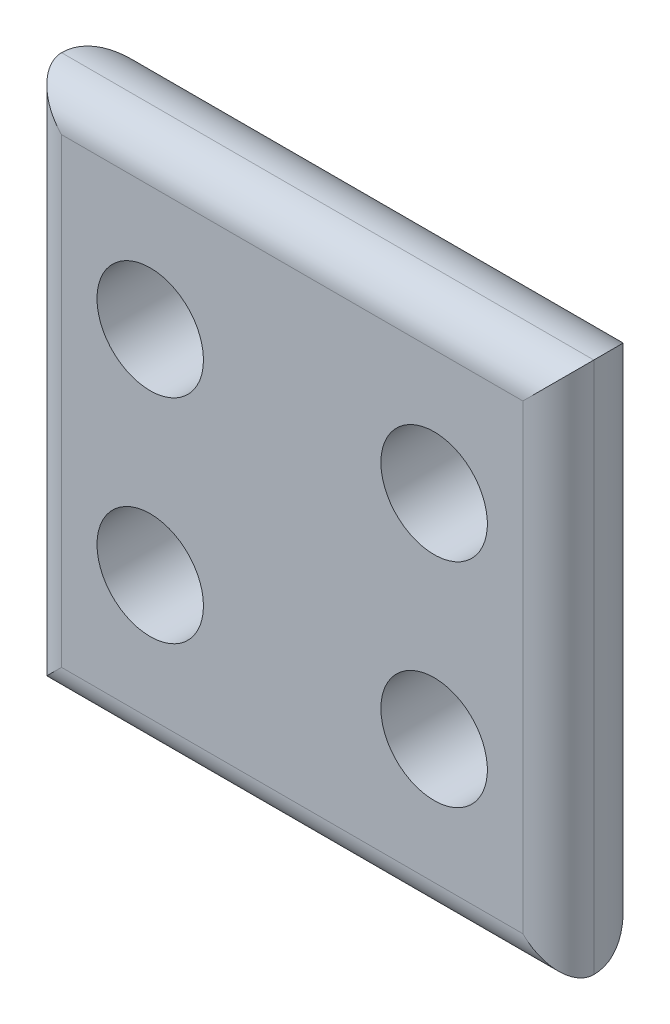
ISO-10303-21;
HEADER;
FILE_DESCRIPTION(('STEP AP214'),'2;1');
FILE_NAME('part.step','',(''),(''),'','','');
FILE_SCHEMA(('AUTOMOTIVE_DESIGN { 1 0 10303 214 1 1 1 1 }'));
ENDSEC;
DATA;
#1=APPLICATION_CONTEXT('core data for automotive mechanical design processes');
#2=APPLICATION_PROTOCOL_DEFINITION('international standard','automotive_design',2000,#1);
#3=PRODUCT_CONTEXT('',#1,'mechanical');
#4=PRODUCT('Part','Part','',(#3));
#5=PRODUCT_RELATED_PRODUCT_CATEGORY('part','',(#4));
#6=PRODUCT_DEFINITION_FORMATION('','',#4);
#7=PRODUCT_DEFINITION_CONTEXT('part definition',#1,'design');
#8=PRODUCT_DEFINITION('design','',#6,#7);
#9=PRODUCT_DEFINITION_SHAPE('','',#8);
#10=(LENGTH_UNIT() NAMED_UNIT(*) SI_UNIT(.MILLI.,.METRE.));
#11=(NAMED_UNIT(*) PLANE_ANGLE_UNIT() SI_UNIT($,.RADIAN.));
#12=(NAMED_UNIT(*) SI_UNIT($,.STERADIAN.) SOLID_ANGLE_UNIT());
#13=UNCERTAINTY_MEASURE_WITH_UNIT(LENGTH_MEASURE(1.E-05),#10,'distance_accuracy_value','');
#14=(GEOMETRIC_REPRESENTATION_CONTEXT(3) GLOBAL_UNCERTAINTY_ASSIGNED_CONTEXT((#13)) GLOBAL_UNIT_ASSIGNED_CONTEXT((#10,
#11,#12)) REPRESENTATION_CONTEXT('',''));
#15=CARTESIAN_POINT('',(0.,0.,0.));
#16=DIRECTION('',(0.,0.,1.));
#17=DIRECTION('',(1.,0.,0.));
#18=AXIS2_PLACEMENT_3D('',#15,#16,#17);
#19=CARTESIAN_POINT('',(0.,0.,3.));
#20=DIRECTION('',(0.,0.,1.));
#21=DIRECTION('',(1.,0.,0.));
#22=AXIS2_PLACEMENT_3D('',#19,#20,#21);
#23=PLANE('',#22);
#24=DIRECTION('',(1.,0.,0.));
#25=VECTOR('',#24,1.);
#26=CARTESIAN_POINT('',(7.5,-6.5,3.));
#27=LINE('',#26,#25);
#28=CARTESIAN_POINT('',(-6.5,-6.5,3.));
#29=VERTEX_POINT('',#28);
#30=CARTESIAN_POINT('',(6.5,-6.5,3.));
#31=VERTEX_POINT('',#30);
#32=EDGE_CURVE('E131',#29,#31,#27,.T.);
#33=ORIENTED_EDGE('',*,*,#32,.T.);
#34=DIRECTION('',(0.,1.,0.));
#35=VECTOR('',#34,1.);
#36=CARTESIAN_POINT('',(6.5,7.5,3.));
#37=LINE('',#36,#35);
#38=CARTESIAN_POINT('',(6.5,6.5,3.));
#39=VERTEX_POINT('',#38);
#40=EDGE_CURVE('E112',#31,#39,#37,.T.);
#41=ORIENTED_EDGE('',*,*,#40,.T.);
#42=DIRECTION('',(-1.,0.,0.));
#43=VECTOR('',#42,1.);
#44=CARTESIAN_POINT('',(-7.5,6.5,3.));
#45=LINE('',#44,#43);
#46=CARTESIAN_POINT('',(-6.5,6.5,3.));
#47=VERTEX_POINT('',#46);
#48=EDGE_CURVE('E121',#39,#47,#45,.T.);
#49=ORIENTED_EDGE('',*,*,#48,.T.);
#50=DIRECTION('',(0.,-1.,0.));
#51=VECTOR('',#50,1.);
#52=CARTESIAN_POINT('',(-6.5,-7.5,3.));
#53=LINE('',#52,#51);
#54=EDGE_CURVE('E126',#47,#29,#53,.T.);
#55=ORIENTED_EDGE('',*,*,#54,.T.);
#56=EDGE_LOOP('',(#33,#41,#49,#55));
#57=FACE_BOUND('',#56,.T.);
#58=CARTESIAN_POINT('',(-4.,-3.,3.));
#59=DIRECTION('',(0.,0.,1.));
#60=DIRECTION('',(1.,0.,0.));
#61=AXIS2_PLACEMENT_3D('',#58,#59,#60);
#62=CIRCLE('',#61,1.5);
#63=CARTESIAN_POINT('',(-2.50000000000001,-3.,3.));
#64=VERTEX_POINT('',#63);
#65=EDGE_CURVE('E251',#64,#64,#62,.T.);
#66=ORIENTED_EDGE('',*,*,#65,.F.);
#67=EDGE_LOOP('',(#66));
#68=FACE_BOUND('',#67,.T.);
#69=CARTESIAN_POINT('',(-4.,3.,3.));
#70=DIRECTION('',(0.,0.,1.));
#71=DIRECTION('',(1.,0.,0.));
#72=AXIS2_PLACEMENT_3D('',#69,#70,#71);
#73=CIRCLE('',#72,1.5);
#74=CARTESIAN_POINT('',(-2.50000000000001,3.,3.));
#75=VERTEX_POINT('',#74);
#76=EDGE_CURVE('E127',#75,#75,#73,.T.);
#77=ORIENTED_EDGE('',*,*,#76,.F.);
#78=EDGE_LOOP('',(#77));
#79=FACE_BOUND('',#78,.T.);
#80=CARTESIAN_POINT('',(4.,-3.,3.));
#81=DIRECTION('',(0.,0.,1.));
#82=DIRECTION('',(-1.,0.,0.));
#83=AXIS2_PLACEMENT_3D('',#80,#81,#82);
#84=CIRCLE('',#83,1.5);
#85=CARTESIAN_POINT('',(2.50000000000001,-3.,3.));
#86=VERTEX_POINT('',#85);
#87=EDGE_CURVE('E186',#86,#86,#84,.T.);
#88=ORIENTED_EDGE('',*,*,#87,.F.);
#89=EDGE_LOOP('',(#88));
#90=FACE_BOUND('',#89,.T.);
#91=CARTESIAN_POINT('',(4.,3.,3.));
#92=DIRECTION('',(0.,0.,1.));
#93=DIRECTION('',(-1.,0.,0.));
#94=AXIS2_PLACEMENT_3D('',#91,#92,#93);
#95=CIRCLE('',#94,1.5);
#96=CARTESIAN_POINT('',(2.50000000000001,3.,3.));
#97=VERTEX_POINT('',#96);
#98=EDGE_CURVE('E254',#97,#97,#95,.T.);
#99=ORIENTED_EDGE('',*,*,#98,.F.);
#100=EDGE_LOOP('',(#99));
#101=FACE_BOUND('',#100,.T.);
#102=ADVANCED_FACE('F39',(#57,#68,#79,#90,#101),#23,.T.);
#103=CARTESIAN_POINT('',(0.,0.,0.));
#104=DIRECTION('',(0.,0.,1.));
#105=DIRECTION('',(1.,0.,0.));
#106=AXIS2_PLACEMENT_3D('',#103,#104,#105);
#107=PLANE('',#106);
#108=CARTESIAN_POINT('',(4.,3.,0.));
#109=DIRECTION('',(0.,0.,1.));
#110=DIRECTION('',(-1.,0.,0.));
#111=AXIS2_PLACEMENT_3D('',#108,#109,#110);
#112=CIRCLE('',#111,1.5);
#113=CARTESIAN_POINT('',(5.5,3.,0.));
#114=VERTEX_POINT('',#113);
#115=EDGE_CURVE('E151',#114,#114,#112,.T.);
#116=ORIENTED_EDGE('',*,*,#115,.T.);
#117=DIRECTION('',(0.,1.,0.));
#118=VECTOR('',#117,1.);
#119=CARTESIAN_POINT('',(5.5,0.,0.));
#120=LINE('',#119,#118);
#121=CARTESIAN_POINT('',(5.5,-3.,0.));
#122=VERTEX_POINT('',#121);
#123=EDGE_CURVE('E11',#114,#122,#120,.F.);
#124=ORIENTED_EDGE('',*,*,#123,.T.);
#125=CARTESIAN_POINT('',(4.,-3.,0.));
#126=DIRECTION('',(0.,0.,1.));
#127=DIRECTION('',(-1.,0.,0.));
#128=AXIS2_PLACEMENT_3D('',#125,#126,#127);
#129=CIRCLE('',#128,1.5);
#130=EDGE_CURVE('E191',#122,#122,#129,.T.);
#131=ORIENTED_EDGE('',*,*,#130,.T.);
#132=DIRECTION('',(0.,1.,0.));
#133=VECTOR('',#132,1.);
#134=CARTESIAN_POINT('',(5.5,0.,0.));
#135=LINE('',#134,#133);
#136=CARTESIAN_POINT('',(5.5,-5.5,0.));
#137=VERTEX_POINT('',#136);
#138=EDGE_CURVE('E48',#122,#137,#135,.F.);
#139=ORIENTED_EDGE('',*,*,#138,.T.);
#140=DIRECTION('',(1.,0.,0.));
#141=VECTOR('',#140,1.);
#142=CARTESIAN_POINT('',(0.,-5.5,0.));
#143=LINE('',#142,#141);
#144=CARTESIAN_POINT('',(-5.5,-5.5,0.));
#145=VERTEX_POINT('',#144);
#146=EDGE_CURVE('E161',#137,#145,#143,.F.);
#147=ORIENTED_EDGE('',*,*,#146,.T.);
#148=DIRECTION('',(0.,-1.,0.));
#149=VECTOR('',#148,1.);
#150=CARTESIAN_POINT('',(-5.5,0.,0.));
#151=LINE('',#150,#149);
#152=CARTESIAN_POINT('',(-5.5,-3.,0.));
#153=VERTEX_POINT('',#152);
#154=EDGE_CURVE('E159',#145,#153,#151,.F.);
#155=ORIENTED_EDGE('',*,*,#154,.T.);
#156=CARTESIAN_POINT('',(-4.,-3.,0.));
#157=DIRECTION('',(0.,0.,1.));
#158=DIRECTION('',(1.,0.,0.));
#159=AXIS2_PLACEMENT_3D('',#156,#157,#158);
#160=CIRCLE('',#159,1.5);
#161=EDGE_CURVE('E256',#153,#153,#160,.T.);
#162=ORIENTED_EDGE('',*,*,#161,.T.);
#163=DIRECTION('',(0.,-1.,0.));
#164=VECTOR('',#163,1.);
#165=CARTESIAN_POINT('',(-5.5,0.,0.));
#166=LINE('',#165,#164);
#167=CARTESIAN_POINT('',(-5.5,3.,0.));
#168=VERTEX_POINT('',#167);
#169=EDGE_CURVE('E157',#153,#168,#166,.F.);
#170=ORIENTED_EDGE('',*,*,#169,.T.);
#171=CARTESIAN_POINT('',(-4.,3.,0.));
#172=DIRECTION('',(0.,0.,1.));
#173=DIRECTION('',(1.,0.,0.));
#174=AXIS2_PLACEMENT_3D('',#171,#172,#173);
#175=CIRCLE('',#174,1.5);
#176=EDGE_CURVE('E183',#168,#168,#175,.T.);
#177=ORIENTED_EDGE('',*,*,#176,.T.);
#178=DIRECTION('',(0.,-1.,0.));
#179=VECTOR('',#178,1.);
#180=CARTESIAN_POINT('',(-5.5,0.,0.));
#181=LINE('',#180,#179);
#182=CARTESIAN_POINT('',(-5.5,5.5,0.));
#183=VERTEX_POINT('',#182);
#184=EDGE_CURVE('E155',#168,#183,#181,.F.);
#185=ORIENTED_EDGE('',*,*,#184,.T.);
#186=DIRECTION('',(-1.,0.,0.));
#187=VECTOR('',#186,1.);
#188=CARTESIAN_POINT('',(0.,5.5,0.));
#189=LINE('',#188,#187);
#190=CARTESIAN_POINT('',(5.5,5.5,0.));
#191=VERTEX_POINT('',#190);
#192=EDGE_CURVE('E144',#183,#191,#189,.F.);
#193=ORIENTED_EDGE('',*,*,#192,.T.);
#194=DIRECTION('',(0.,1.,0.));
#195=VECTOR('',#194,1.);
#196=CARTESIAN_POINT('',(5.5,0.,0.));
#197=LINE('',#196,#195);
#198=EDGE_CURVE('E153',#191,#114,#197,.F.);
#199=ORIENTED_EDGE('',*,*,#198,.T.);
#200=EDGE_LOOP('',(#116,#124,#131,#139,#147,#155,#162,#170,#177,#185,#193,#199));
#201=FACE_BOUND('',#200,.T.);
#202=ADVANCED_FACE('F180',(#201),#107,.F.);
#203=CARTESIAN_POINT('',(-4.,3.,3.));
#204=DIRECTION('',(0.,0.,-1.));
#205=DIRECTION('',(-1.,0.,0.));
#206=AXIS2_PLACEMENT_3D('',#203,#204,#205);
#207=CYLINDRICAL_SURFACE('',#206,1.5);
#208=ORIENTED_EDGE('',*,*,#76,.T.);
#209=EDGE_LOOP('',(#208));
#210=FACE_BOUND('',#209,.T.);
#211=ORIENTED_EDGE('',*,*,#176,.F.);
#212=EDGE_LOOP('',(#211));
#213=FACE_BOUND('',#212,.T.);
#214=ADVANCED_FACE('F215',(#210,#213),#207,.F.);
#215=CARTESIAN_POINT('',(4.,-3.,3.));
#216=DIRECTION('',(0.,0.,-1.));
#217=DIRECTION('',(-1.,0.,0.));
#218=AXIS2_PLACEMENT_3D('',#215,#216,#217);
#219=CYLINDRICAL_SURFACE('',#218,1.5);
#220=ORIENTED_EDGE('',*,*,#87,.T.);
#221=EDGE_LOOP('',(#220));
#222=FACE_BOUND('',#221,.T.);
#223=ORIENTED_EDGE('',*,*,#130,.F.);
#224=EDGE_LOOP('',(#223));
#225=FACE_BOUND('',#224,.T.);
#226=ADVANCED_FACE('F237',(#222,#225),#219,.F.);
#227=CARTESIAN_POINT('',(-4.,-3.,3.));
#228=DIRECTION('',(0.,0.,-1.));
#229=DIRECTION('',(-1.,0.,0.));
#230=AXIS2_PLACEMENT_3D('',#227,#228,#229);
#231=CYLINDRICAL_SURFACE('',#230,1.5);
#232=ORIENTED_EDGE('',*,*,#65,.T.);
#233=EDGE_LOOP('',(#232));
#234=FACE_BOUND('',#233,.T.);
#235=ORIENTED_EDGE('',*,*,#161,.F.);
#236=EDGE_LOOP('',(#235));
#237=FACE_BOUND('',#236,.T.);
#238=ADVANCED_FACE('F231',(#234,#237),#231,.F.);
#239=CARTESIAN_POINT('',(4.,3.,3.));
#240=DIRECTION('',(0.,0.,-1.));
#241=DIRECTION('',(-1.,0.,0.));
#242=AXIS2_PLACEMENT_3D('',#239,#240,#241);
#243=CYLINDRICAL_SURFACE('',#242,1.5);
#244=ORIENTED_EDGE('',*,*,#98,.T.);
#245=EDGE_LOOP('',(#244));
#246=FACE_BOUND('',#245,.T.);
#247=ORIENTED_EDGE('',*,*,#115,.F.);
#248=EDGE_LOOP('',(#247));
#249=FACE_BOUND('',#248,.T.);
#250=ADVANCED_FACE('F227',(#246,#249),#243,.F.);
#251=CARTESIAN_POINT('',(-6.5,0.,2.));
#252=DIRECTION('',(0.,1.,0.));
#253=DIRECTION('',(-1.,0.,0.));
#254=AXIS2_PLACEMENT_3D('',#251,#252,#253);
#255=CYLINDRICAL_SURFACE('',#254,1.);
#256=CARTESIAN_POINT('',(-6.5,6.5,2.));
#257=DIRECTION('',(0.707106781186547,0.707106781186548,0.));
#258=DIRECTION('',(0.707106781186547,-0.707106781186547,0.));
#259=AXIS2_PLACEMENT_3D('',#256,#257,#258);
#260=ELLIPSE('',#259,1.4142135623731,1.);
#261=CARTESIAN_POINT('',(-7.5,7.5,2.));
#262=VERTEX_POINT('',#261);
#263=EDGE_CURVE('E123',#262,#47,#260,.T.);
#264=ORIENTED_EDGE('',*,*,#263,.F.);
#265=DIRECTION('',(0.,-1.,0.));
#266=VECTOR('',#265,1.);
#267=CARTESIAN_POINT('',(-7.5,7.5,2.));
#268=LINE('',#267,#266);
#269=CARTESIAN_POINT('',(-7.5,-7.5,2.));
#270=VERTEX_POINT('',#269);
#271=EDGE_CURVE('E140',#270,#262,#268,.F.);
#272=ORIENTED_EDGE('',*,*,#271,.F.);
#273=CARTESIAN_POINT('',(-6.5,-6.5,2.));
#274=DIRECTION('',(-0.707106781186547,0.707106781186547,0.));
#275=DIRECTION('',(0.707106781186547,0.707106781186548,0.));
#276=AXIS2_PLACEMENT_3D('',#273,#274,#275);
#277=ELLIPSE('',#276,1.41421356237309,1.);
#278=EDGE_CURVE('E148',#29,#270,#277,.F.);
#279=ORIENTED_EDGE('',*,*,#278,.F.);
#280=ORIENTED_EDGE('',*,*,#54,.F.);
#281=EDGE_LOOP('',(#264,#272,#279,#280));
#282=FACE_BOUND('',#281,.T.);
#283=ADVANCED_FACE('F196',(#282),#255,.T.);
#284=CARTESIAN_POINT('',(0.,-6.5,2.));
#285=DIRECTION('',(-1.,0.,0.));
#286=DIRECTION('',(0.,0.,1.));
#287=AXIS2_PLACEMENT_3D('',#284,#285,#286);
#288=CYLINDRICAL_SURFACE('',#287,1.);
#289=ORIENTED_EDGE('',*,*,#278,.T.);
#290=DIRECTION('',(1.,0.,0.));
#291=VECTOR('',#290,1.);
#292=CARTESIAN_POINT('',(-7.5,-7.5,2.));
#293=LINE('',#292,#291);
#294=CARTESIAN_POINT('',(7.5,-7.5,2.));
#295=VERTEX_POINT('',#294);
#296=EDGE_CURVE('E134',#295,#270,#293,.F.);
#297=ORIENTED_EDGE('',*,*,#296,.F.);
#298=CARTESIAN_POINT('',(6.5,-6.5,2.));
#299=DIRECTION('',(-0.707106781186547,-0.707106781186548,0.));
#300=DIRECTION('',(-0.707106781186548,0.707106781186547,0.));
#301=AXIS2_PLACEMENT_3D('',#298,#299,#300);
#302=ELLIPSE('',#301,1.4142135623731,1.);
#303=EDGE_CURVE('E118',#31,#295,#302,.F.);
#304=ORIENTED_EDGE('',*,*,#303,.F.);
#305=ORIENTED_EDGE('',*,*,#32,.F.);
#306=EDGE_LOOP('',(#289,#297,#304,#305));
#307=FACE_BOUND('',#306,.T.);
#308=ADVANCED_FACE('F199',(#307),#288,.T.);
#309=CARTESIAN_POINT('',(0.,6.5,2.));
#310=DIRECTION('',(1.,0.,0.));
#311=DIRECTION('',(0.,0.,-1.));
#312=AXIS2_PLACEMENT_3D('',#309,#310,#311);
#313=CYLINDRICAL_SURFACE('',#312,1.);
#314=ORIENTED_EDGE('',*,*,#263,.T.);
#315=ORIENTED_EDGE('',*,*,#48,.F.);
#316=CARTESIAN_POINT('',(6.5,6.5,2.));
#317=DIRECTION('',(0.707106781186548,-0.707106781186547,0.));
#318=DIRECTION('',(0.707106781186547,0.707106781186548,0.));
#319=AXIS2_PLACEMENT_3D('',#316,#317,#318);
#320=ELLIPSE('',#319,1.41421356237309,1.);
#321=CARTESIAN_POINT('',(7.5,7.5,2.));
#322=VERTEX_POINT('',#321);
#323=EDGE_CURVE('E107',#322,#39,#320,.T.);
#324=ORIENTED_EDGE('',*,*,#323,.F.);
#325=DIRECTION('',(-1.,0.,0.));
#326=VECTOR('',#325,1.);
#327=CARTESIAN_POINT('',(7.5,7.5,2.));
#328=LINE('',#327,#326);
#329=EDGE_CURVE('E143',#262,#322,#328,.F.);
#330=ORIENTED_EDGE('',*,*,#329,.F.);
#331=EDGE_LOOP('',(#314,#315,#324,#330));
#332=FACE_BOUND('',#331,.T.);
#333=ADVANCED_FACE('F122',(#332),#313,.T.);
#334=CARTESIAN_POINT('',(6.5,0.,2.));
#335=DIRECTION('',(0.,-1.,0.));
#336=DIRECTION('',(1.,0.,0.));
#337=AXIS2_PLACEMENT_3D('',#334,#335,#336);
#338=CYLINDRICAL_SURFACE('',#337,1.);
#339=ORIENTED_EDGE('',*,*,#303,.T.);
#340=DIRECTION('',(0.,1.,0.));
#341=VECTOR('',#340,1.);
#342=CARTESIAN_POINT('',(7.5,-7.5,2.));
#343=LINE('',#342,#341);
#344=EDGE_CURVE('E114',#322,#295,#343,.F.);
#345=ORIENTED_EDGE('',*,*,#344,.F.);
#346=ORIENTED_EDGE('',*,*,#323,.T.);
#347=ORIENTED_EDGE('',*,*,#40,.F.);
#348=EDGE_LOOP('',(#339,#345,#346,#347));
#349=FACE_BOUND('',#348,.T.);
#350=ADVANCED_FACE('F110',(#349),#338,.T.);
#351=CARTESIAN_POINT('',(-7.5,5.5,2.));
#352=DIRECTION('',(-1.,0.,0.));
#353=DIRECTION('',(0.,0.,1.));
#354=AXIS2_PLACEMENT_3D('',#351,#352,#353);
#355=CYLINDRICAL_SURFACE('',#354,2.);
#356=CARTESIAN_POINT('',(5.5,5.5,2.));
#357=DIRECTION('',(-0.707106781186548,0.707106781186547,0.));
#358=DIRECTION('',(-0.707106781186547,-0.707106781186548,0.));
#359=AXIS2_PLACEMENT_3D('',#356,#357,#358);
#360=ELLIPSE('',#359,2.82842712474619,2.);
#361=EDGE_CURVE('E166',#191,#322,#360,.F.);
#362=ORIENTED_EDGE('',*,*,#361,.F.);
#363=ORIENTED_EDGE('',*,*,#192,.F.);
#364=CARTESIAN_POINT('',(-5.5,5.5,2.));
#365=DIRECTION('',(-0.707106781186547,-0.707106781186548,0.));
#366=DIRECTION('',(-0.707106781186547,0.707106781186547,0.));
#367=AXIS2_PLACEMENT_3D('',#364,#365,#366);
#368=ELLIPSE('',#367,2.82842712474619,2.);
#369=EDGE_CURVE('E43',#262,#183,#368,.T.);
#370=ORIENTED_EDGE('',*,*,#369,.F.);
#371=ORIENTED_EDGE('',*,*,#329,.T.);
#372=EDGE_LOOP('',(#362,#363,#370,#371));
#373=FACE_BOUND('',#372,.T.);
#374=ADVANCED_FACE('F41',(#373),#355,.T.);
#375=CARTESIAN_POINT('',(-5.5,7.5,2.));
#376=DIRECTION('',(0.,-1.,0.));
#377=DIRECTION('',(1.,0.,0.));
#378=AXIS2_PLACEMENT_3D('',#375,#376,#377);
#379=CYLINDRICAL_SURFACE('',#378,2.);
#380=ORIENTED_EDGE('',*,*,#169,.F.);
#381=ORIENTED_EDGE('',*,*,#154,.F.);
#382=CARTESIAN_POINT('',(-5.5,-5.5,2.));
#383=DIRECTION('',(0.707106781186547,-0.707106781186547,0.));
#384=DIRECTION('',(-0.707106781186547,-0.707106781186548,0.));
#385=AXIS2_PLACEMENT_3D('',#382,#383,#384);
#386=ELLIPSE('',#385,2.82842712474619,2.);
#387=EDGE_CURVE('E62',#270,#145,#386,.T.);
#388=ORIENTED_EDGE('',*,*,#387,.F.);
#389=ORIENTED_EDGE('',*,*,#271,.T.);
#390=ORIENTED_EDGE('',*,*,#369,.T.);
#391=ORIENTED_EDGE('',*,*,#184,.F.);
#392=EDGE_LOOP('',(#380,#381,#388,#389,#390,#391));
#393=FACE_BOUND('',#392,.T.);
#394=ADVANCED_FACE('F176',(#393),#379,.T.);
#395=CARTESIAN_POINT('',(5.5,7.5,2.));
#396=DIRECTION('',(0.,1.,0.));
#397=DIRECTION('',(-1.,0.,0.));
#398=AXIS2_PLACEMENT_3D('',#395,#396,#397);
#399=CYLINDRICAL_SURFACE('',#398,2.);
#400=ORIENTED_EDGE('',*,*,#361,.T.);
#401=ORIENTED_EDGE('',*,*,#344,.T.);
#402=CARTESIAN_POINT('',(5.5,-5.5,2.));
#403=DIRECTION('',(0.707106781186547,0.707106781186548,0.));
#404=DIRECTION('',(-0.707106781186548,0.707106781186547,0.));
#405=AXIS2_PLACEMENT_3D('',#402,#403,#404);
#406=ELLIPSE('',#405,2.82842712474619,2.);
#407=EDGE_CURVE('E164',#137,#295,#406,.F.);
#408=ORIENTED_EDGE('',*,*,#407,.F.);
#409=ORIENTED_EDGE('',*,*,#138,.F.);
#410=ORIENTED_EDGE('',*,*,#123,.F.);
#411=ORIENTED_EDGE('',*,*,#198,.F.);
#412=EDGE_LOOP('',(#400,#401,#408,#409,#410,#411));
#413=FACE_BOUND('',#412,.T.);
#414=ADVANCED_FACE('F202',(#413),#399,.T.);
#415=CARTESIAN_POINT('',(-7.5,-5.5,2.));
#416=DIRECTION('',(1.,0.,0.));
#417=DIRECTION('',(0.,0.,-1.));
#418=AXIS2_PLACEMENT_3D('',#415,#416,#417);
#419=CYLINDRICAL_SURFACE('',#418,2.);
#420=ORIENTED_EDGE('',*,*,#387,.T.);
#421=ORIENTED_EDGE('',*,*,#146,.F.);
#422=ORIENTED_EDGE('',*,*,#407,.T.);
#423=ORIENTED_EDGE('',*,*,#296,.T.);
#424=EDGE_LOOP('',(#420,#421,#422,#423));
#425=FACE_BOUND('',#424,.T.);
#426=ADVANCED_FACE('F200',(#425),#419,.T.);
#427=CLOSED_SHELL('',(#102,#202,#214,#226,#238,#250,#283,#308,#333,#350,#374,#394,#414,#426));
#428=MANIFOLD_SOLID_BREP('B2',#427);
#429=ADVANCED_BREP_SHAPE_REPRESENTATION('',(#18,#428),#14);
#430=SHAPE_DEFINITION_REPRESENTATION(#9,#429);
ENDSEC;
END-ISO-10303-21;
